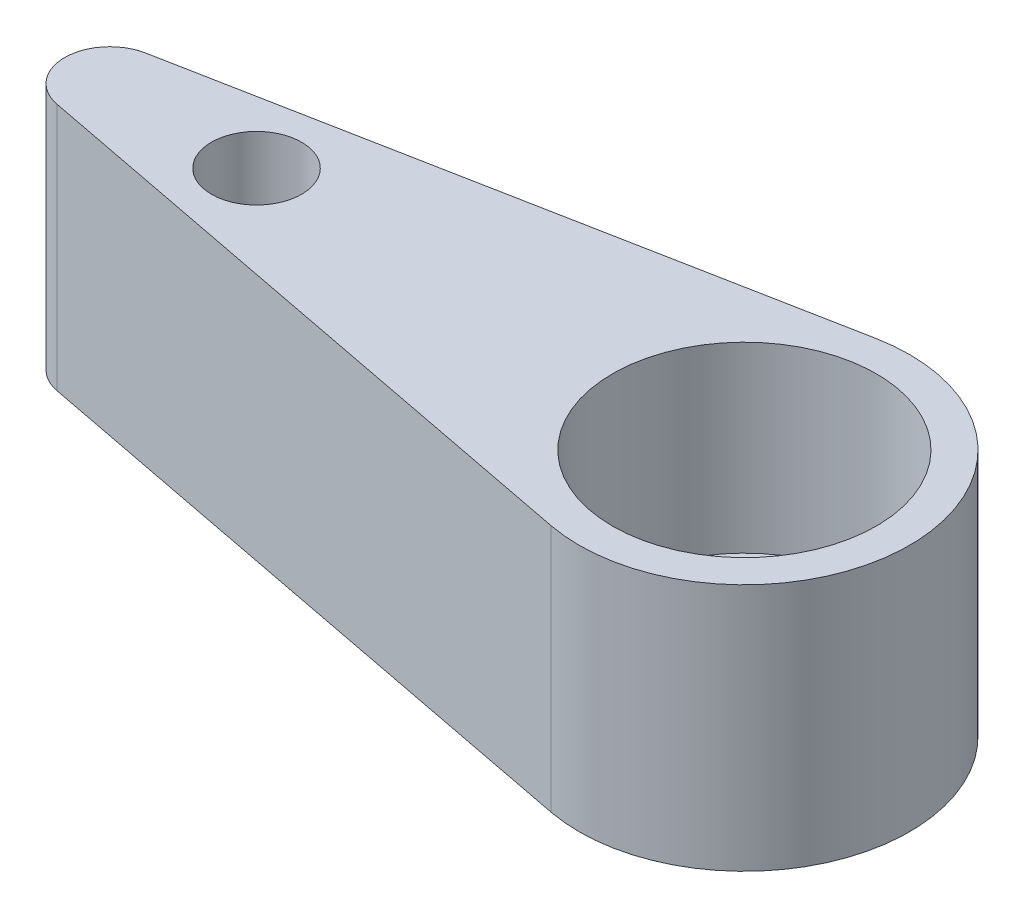
ISO-10303-21;
HEADER;
FILE_DESCRIPTION(('STEP AP214'),'2;1');
FILE_NAME('part.step','',(''),(''),'','','');
FILE_SCHEMA(('AUTOMOTIVE_DESIGN { 1 0 10303 214 1 1 1 1 }'));
ENDSEC;
DATA;
#1=APPLICATION_CONTEXT('core data for automotive mechanical design processes');
#2=APPLICATION_PROTOCOL_DEFINITION('international standard','automotive_design',2000,#1);
#3=PRODUCT_CONTEXT('',#1,'mechanical');
#4=PRODUCT('Part','Part','',(#3));
#5=PRODUCT_RELATED_PRODUCT_CATEGORY('part','',(#4));
#6=PRODUCT_DEFINITION_FORMATION('','',#4);
#7=PRODUCT_DEFINITION_CONTEXT('part definition',#1,'design');
#8=PRODUCT_DEFINITION('design','',#6,#7);
#9=PRODUCT_DEFINITION_SHAPE('','',#8);
#10=(LENGTH_UNIT() NAMED_UNIT(*) SI_UNIT(.MILLI.,.METRE.));
#11=(NAMED_UNIT(*) PLANE_ANGLE_UNIT() SI_UNIT($,.RADIAN.));
#12=(NAMED_UNIT(*) SI_UNIT($,.STERADIAN.) SOLID_ANGLE_UNIT());
#13=UNCERTAINTY_MEASURE_WITH_UNIT(LENGTH_MEASURE(1.E-05),#10,'distance_accuracy_value','');
#14=(GEOMETRIC_REPRESENTATION_CONTEXT(3) GLOBAL_UNCERTAINTY_ASSIGNED_CONTEXT((#13)) GLOBAL_UNIT_ASSIGNED_CONTEXT((#10,
#11,#12)) REPRESENTATION_CONTEXT('',''));
#15=CARTESIAN_POINT('',(0.,0.,0.));
#16=DIRECTION('',(0.,0.,1.));
#17=DIRECTION('',(1.,0.,0.));
#18=AXIS2_PLACEMENT_3D('',#15,#16,#17);
#19=CARTESIAN_POINT('',(-0.693125211989533,5.5,3.5960197870996));
#20=DIRECTION('',(0.189264199321032,0.,-0.981926200310069));
#21=DIRECTION('',(-0.981926200310069,0.,-0.189264199321032));
#22=AXIS2_PLACEMENT_3D('',#19,#20,#21);
#23=PLANE('',#22);
#24=DIRECTION('',(0.981926200310069,0.,0.189264199321032));
#25=VECTOR('',#24,1.);
#26=CARTESIAN_POINT('',(-0.693125211989533,0.,3.5960197870996));
#27=LINE('',#26,#25);
#28=CARTESIAN_POINT('',(-14.2553677921472,0.,0.981926200310087));
#29=VERTEX_POINT('',#28);
#30=CARTESIAN_POINT('',(-0.693125211989533,0.,3.5960197870996));
#31=VERTEX_POINT('',#30);
#32=EDGE_CURVE('E110',#29,#31,#27,.T.);
#33=ORIENTED_EDGE('',*,*,#32,.T.);
#34=DIRECTION('',(0.,-1.,0.));
#35=VECTOR('',#34,1.);
#36=CARTESIAN_POINT('',(-0.693125211989533,5.5,3.5960197870996));
#37=LINE('',#36,#35);
#38=CARTESIAN_POINT('',(-0.693125211989533,5.5,3.5960197870996));
#39=VERTEX_POINT('',#38);
#40=EDGE_CURVE('E11',#39,#31,#37,.T.);
#41=ORIENTED_EDGE('',*,*,#40,.F.);
#42=DIRECTION('',(0.981926200310069,0.,0.189264199321032));
#43=VECTOR('',#42,1.);
#44=CARTESIAN_POINT('',(-0.693125211989533,5.5,3.5960197870996));
#45=LINE('',#44,#43);
#46=CARTESIAN_POINT('',(-14.2553677921472,5.5,0.981926200310087));
#47=VERTEX_POINT('',#46);
#48=EDGE_CURVE('E94',#47,#39,#45,.T.);
#49=ORIENTED_EDGE('',*,*,#48,.F.);
#50=DIRECTION('',(0.,-1.,0.));
#51=VECTOR('',#50,1.);
#52=CARTESIAN_POINT('',(-14.2553677921472,5.5,0.981926200310087));
#53=LINE('',#52,#51);
#54=EDGE_CURVE('E106',#47,#29,#53,.T.);
#55=ORIENTED_EDGE('',*,*,#54,.T.);
#56=EDGE_LOOP('',(#33,#41,#49,#55));
#57=FACE_BOUND('',#56,.T.);
#58=ADVANCED_FACE('F42',(#57),#23,.F.);
#59=CARTESIAN_POINT('',(0.,5.5,0.));
#60=DIRECTION('',(0.,-1.,0.));
#61=DIRECTION('',(0.,0.,-1.));
#62=AXIS2_PLACEMENT_3D('',#59,#60,#61);
#63=CYLINDRICAL_SURFACE('',#62,3.66220983406295);
#64=CARTESIAN_POINT('',(0.,0.,0.));
#65=DIRECTION('',(0.,1.,0.));
#66=DIRECTION('',(0.,0.,1.));
#67=AXIS2_PLACEMENT_3D('',#64,#65,#66);
#68=CIRCLE('',#67,3.66220983406295);
#69=CARTESIAN_POINT('',(-0.693125211989534,0.,-3.5960197870996));
#70=VERTEX_POINT('',#69);
#71=EDGE_CURVE('E99',#31,#70,#68,.T.);
#72=ORIENTED_EDGE('',*,*,#71,.T.);
#73=DIRECTION('',(0.,-1.,0.));
#74=VECTOR('',#73,1.);
#75=CARTESIAN_POINT('',(-0.693125211989534,5.5,-3.5960197870996));
#76=LINE('',#75,#74);
#77=CARTESIAN_POINT('',(-0.693125211989534,5.5,-3.5960197870996));
#78=VERTEX_POINT('',#77);
#79=EDGE_CURVE('E51',#78,#70,#76,.T.);
#80=ORIENTED_EDGE('',*,*,#79,.F.);
#81=CARTESIAN_POINT('',(0.,5.5,0.));
#82=DIRECTION('',(0.,1.,0.));
#83=DIRECTION('',(0.,0.,1.));
#84=AXIS2_PLACEMENT_3D('',#81,#82,#83);
#85=CIRCLE('',#84,3.66220983406295);
#86=EDGE_CURVE('E89',#39,#78,#85,.T.);
#87=ORIENTED_EDGE('',*,*,#86,.F.);
#88=ORIENTED_EDGE('',*,*,#40,.T.);
#89=EDGE_LOOP('',(#72,#80,#87,#88));
#90=FACE_BOUND('',#89,.T.);
#91=ADVANCED_FACE('F98',(#90),#63,.T.);
#92=CARTESIAN_POINT('',(-0.693125211989534,5.5,-3.5960197870996));
#93=DIRECTION('',(0.189264199321032,0.,0.981926200310069));
#94=DIRECTION('',(0.981926200310069,0.,-0.189264199321032));
#95=AXIS2_PLACEMENT_3D('',#92,#93,#94);
#96=PLANE('',#95);
#97=DIRECTION('',(-0.981926200310069,0.,0.189264199321032));
#98=VECTOR('',#97,1.);
#99=CARTESIAN_POINT('',(-0.693125211989534,0.,-3.5960197870996));
#100=LINE('',#99,#98);
#101=CARTESIAN_POINT('',(-14.2553677921472,0.,-0.981926200310088));
#102=VERTEX_POINT('',#101);
#103=EDGE_CURVE('E76',#70,#102,#100,.T.);
#104=ORIENTED_EDGE('',*,*,#103,.T.);
#105=DIRECTION('',(0.,-1.,0.));
#106=VECTOR('',#105,1.);
#107=CARTESIAN_POINT('',(-14.2553677921472,5.5,-0.981926200310088));
#108=LINE('',#107,#106);
#109=CARTESIAN_POINT('',(-14.2553677921472,5.5,-0.981926200310088));
#110=VERTEX_POINT('',#109);
#111=EDGE_CURVE('E101',#110,#102,#108,.T.);
#112=ORIENTED_EDGE('',*,*,#111,.F.);
#113=DIRECTION('',(-0.981926200310069,0.,0.189264199321032));
#114=VECTOR('',#113,1.);
#115=CARTESIAN_POINT('',(-0.693125211989534,5.5,-3.5960197870996));
#116=LINE('',#115,#114);
#117=EDGE_CURVE('E92',#78,#110,#116,.T.);
#118=ORIENTED_EDGE('',*,*,#117,.F.);
#119=ORIENTED_EDGE('',*,*,#79,.T.);
#120=EDGE_LOOP('',(#104,#112,#118,#119));
#121=FACE_BOUND('',#120,.T.);
#122=ADVANCED_FACE('F102',(#121),#96,.F.);
#123=CARTESIAN_POINT('',(-14.0661035928263,5.5,0.));
#124=DIRECTION('',(0.,-1.,0.));
#125=DIRECTION('',(0.,0.,-1.));
#126=AXIS2_PLACEMENT_3D('',#123,#124,#125);
#127=CYLINDRICAL_SURFACE('',#126,1.);
#128=CARTESIAN_POINT('',(-14.0661035928263,0.,0.));
#129=DIRECTION('',(0.,1.,0.));
#130=DIRECTION('',(0.,0.,1.));
#131=AXIS2_PLACEMENT_3D('',#128,#129,#130);
#132=CIRCLE('',#131,1.);
#133=EDGE_CURVE('E82',#102,#29,#132,.T.);
#134=ORIENTED_EDGE('',*,*,#133,.T.);
#135=ORIENTED_EDGE('',*,*,#54,.F.);
#136=CARTESIAN_POINT('',(-14.0661035928263,5.5,0.));
#137=DIRECTION('',(0.,1.,0.));
#138=DIRECTION('',(0.,0.,1.));
#139=AXIS2_PLACEMENT_3D('',#136,#137,#138);
#140=CIRCLE('',#139,1.);
#141=EDGE_CURVE('E59',#110,#47,#140,.T.);
#142=ORIENTED_EDGE('',*,*,#141,.F.);
#143=ORIENTED_EDGE('',*,*,#111,.T.);
#144=EDGE_LOOP('',(#134,#135,#142,#143));
#145=FACE_BOUND('',#144,.T.);
#146=ADVANCED_FACE('F124',(#145),#127,.T.);
#147=CARTESIAN_POINT('',(0.,5.5,0.));
#148=DIRECTION('',(0.,1.,0.));
#149=DIRECTION('',(0.,0.,1.));
#150=AXIS2_PLACEMENT_3D('',#147,#148,#149);
#151=PLANE('',#150);
#152=CARTESIAN_POINT('',(-10.8143149486275,5.5,0.));
#153=DIRECTION('',(0.,1.,0.));
#154=DIRECTION('',(0.,0.,1.));
#155=AXIS2_PLACEMENT_3D('',#152,#153,#154);
#156=CIRCLE('',#155,1.);
#157=CARTESIAN_POINT('',(-10.8143149486275,5.5,1.));
#158=VERTEX_POINT('',#157);
#159=EDGE_CURVE('E139',#158,#158,#156,.T.);
#160=ORIENTED_EDGE('',*,*,#159,.F.);
#161=EDGE_LOOP('',(#160));
#162=FACE_BOUND('',#161,.T.);
#163=CARTESIAN_POINT('',(0.,5.5,0.));
#164=DIRECTION('',(0.,1.,0.));
#165=DIRECTION('',(0.,0.,1.));
#166=AXIS2_PLACEMENT_3D('',#163,#164,#165);
#167=CIRCLE('',#166,2.925);
#168=CARTESIAN_POINT('',(0.,5.5,2.925));
#169=VERTEX_POINT('',#168);
#170=EDGE_CURVE('E131',#169,#169,#167,.T.);
#171=ORIENTED_EDGE('',*,*,#170,.F.);
#172=EDGE_LOOP('',(#171));
#173=FACE_BOUND('',#172,.T.);
#174=ORIENTED_EDGE('',*,*,#48,.T.);
#175=ORIENTED_EDGE('',*,*,#86,.T.);
#176=ORIENTED_EDGE('',*,*,#117,.T.);
#177=ORIENTED_EDGE('',*,*,#141,.T.);
#178=EDGE_LOOP('',(#174,#175,#176,#177));
#179=FACE_BOUND('',#178,.T.);
#180=ADVANCED_FACE('F90',(#162,#173,#179),#151,.T.);
#181=CARTESIAN_POINT('',(0.,0.,0.));
#182=DIRECTION('',(0.,1.,0.));
#183=DIRECTION('',(0.,0.,1.));
#184=AXIS2_PLACEMENT_3D('',#181,#182,#183);
#185=PLANE('',#184);
#186=CARTESIAN_POINT('',(0.,0.,0.));
#187=DIRECTION('',(0.,1.,0.));
#188=DIRECTION('',(0.,0.,1.));
#189=AXIS2_PLACEMENT_3D('',#186,#187,#188);
#190=CIRCLE('',#189,1.);
#191=CARTESIAN_POINT('',(0.,0.,1.));
#192=VERTEX_POINT('',#191);
#193=EDGE_CURVE('E143',#192,#192,#190,.T.);
#194=ORIENTED_EDGE('',*,*,#193,.T.);
#195=EDGE_LOOP('',(#194));
#196=FACE_BOUND('',#195,.T.);
#197=CARTESIAN_POINT('',(-10.8143149486275,0.,0.));
#198=DIRECTION('',(0.,1.,0.));
#199=DIRECTION('',(0.,0.,1.));
#200=AXIS2_PLACEMENT_3D('',#197,#198,#199);
#201=CIRCLE('',#200,1.);
#202=CARTESIAN_POINT('',(-10.8143149486275,0.,1.));
#203=VERTEX_POINT('',#202);
#204=EDGE_CURVE('E135',#203,#203,#201,.T.);
#205=ORIENTED_EDGE('',*,*,#204,.T.);
#206=EDGE_LOOP('',(#205));
#207=FACE_BOUND('',#206,.T.);
#208=ORIENTED_EDGE('',*,*,#32,.F.);
#209=ORIENTED_EDGE('',*,*,#133,.F.);
#210=ORIENTED_EDGE('',*,*,#103,.F.);
#211=ORIENTED_EDGE('',*,*,#71,.F.);
#212=EDGE_LOOP('',(#208,#209,#210,#211));
#213=FACE_BOUND('',#212,.T.);
#214=ADVANCED_FACE('F127',(#196,#207,#213),#185,.F.);
#215=CARTESIAN_POINT('',(0.,1.45,0.));
#216=DIRECTION('',(0.,1.,0.));
#217=DIRECTION('',(0.,0.,1.));
#218=AXIS2_PLACEMENT_3D('',#215,#216,#217);
#219=CYLINDRICAL_SURFACE('',#218,2.925);
#220=CARTESIAN_POINT('',(0.,1.45,0.));
#221=DIRECTION('',(0.,1.,0.));
#222=DIRECTION('',(0.,0.,1.));
#223=AXIS2_PLACEMENT_3D('',#220,#221,#222);
#224=CIRCLE('',#223,2.925);
#225=CARTESIAN_POINT('',(0.,1.45,2.925));
#226=VERTEX_POINT('',#225);
#227=EDGE_CURVE('E114',#226,#226,#224,.T.);
#228=ORIENTED_EDGE('',*,*,#227,.F.);
#229=EDGE_LOOP('',(#228));
#230=FACE_BOUND('',#229,.T.);
#231=ORIENTED_EDGE('',*,*,#170,.T.);
#232=EDGE_LOOP('',(#231));
#233=FACE_BOUND('',#232,.T.);
#234=ADVANCED_FACE('F167',(#230,#233),#219,.F.);
#235=CARTESIAN_POINT('',(0.,1.45,0.));
#236=DIRECTION('',(0.,1.,0.));
#237=DIRECTION('',(0.,0.,1.));
#238=AXIS2_PLACEMENT_3D('',#235,#236,#237);
#239=PLANE('',#238);
#240=CARTESIAN_POINT('',(0.,1.45,0.));
#241=DIRECTION('',(0.,1.,0.));
#242=DIRECTION('',(0.,0.,1.));
#243=AXIS2_PLACEMENT_3D('',#240,#241,#242);
#244=CIRCLE('',#243,1.);
#245=CARTESIAN_POINT('',(0.,1.45,1.));
#246=VERTEX_POINT('',#245);
#247=EDGE_CURVE('E147',#246,#246,#244,.T.);
#248=ORIENTED_EDGE('',*,*,#247,.F.);
#249=EDGE_LOOP('',(#248));
#250=FACE_BOUND('',#249,.T.);
#251=ORIENTED_EDGE('',*,*,#227,.T.);
#252=EDGE_LOOP('',(#251));
#253=FACE_BOUND('',#252,.T.);
#254=ADVANCED_FACE('F164',(#250,#253),#239,.T.);
#255=CARTESIAN_POINT('',(-10.8143149486275,0.,0.));
#256=DIRECTION('',(0.,1.,0.));
#257=DIRECTION('',(0.,0.,1.));
#258=AXIS2_PLACEMENT_3D('',#255,#256,#257);
#259=CYLINDRICAL_SURFACE('',#258,1.);
#260=ORIENTED_EDGE('',*,*,#204,.F.);
#261=EDGE_LOOP('',(#260));
#262=FACE_BOUND('',#261,.T.);
#263=ORIENTED_EDGE('',*,*,#159,.T.);
#264=EDGE_LOOP('',(#263));
#265=FACE_BOUND('',#264,.T.);
#266=ADVANCED_FACE('F160',(#262,#265),#259,.F.);
#267=CARTESIAN_POINT('',(0.,0.,0.));
#268=DIRECTION('',(0.,1.,0.));
#269=DIRECTION('',(0.,0.,1.));
#270=AXIS2_PLACEMENT_3D('',#267,#268,#269);
#271=CYLINDRICAL_SURFACE('',#270,1.);
#272=ORIENTED_EDGE('',*,*,#193,.F.);
#273=EDGE_LOOP('',(#272));
#274=FACE_BOUND('',#273,.T.);
#275=ORIENTED_EDGE('',*,*,#247,.T.);
#276=EDGE_LOOP('',(#275));
#277=FACE_BOUND('',#276,.T.);
#278=ADVANCED_FACE('F157',(#274,#277),#271,.F.);
#279=CLOSED_SHELL('',(#58,#91,#122,#146,#180,#214,#234,#254,#266,#278));
#280=MANIFOLD_SOLID_BREP('B2',#279);
#281=ADVANCED_BREP_SHAPE_REPRESENTATION('',(#18,#280),#14);
#282=SHAPE_DEFINITION_REPRESENTATION(#9,#281);
ENDSEC;
END-ISO-10303-21;
